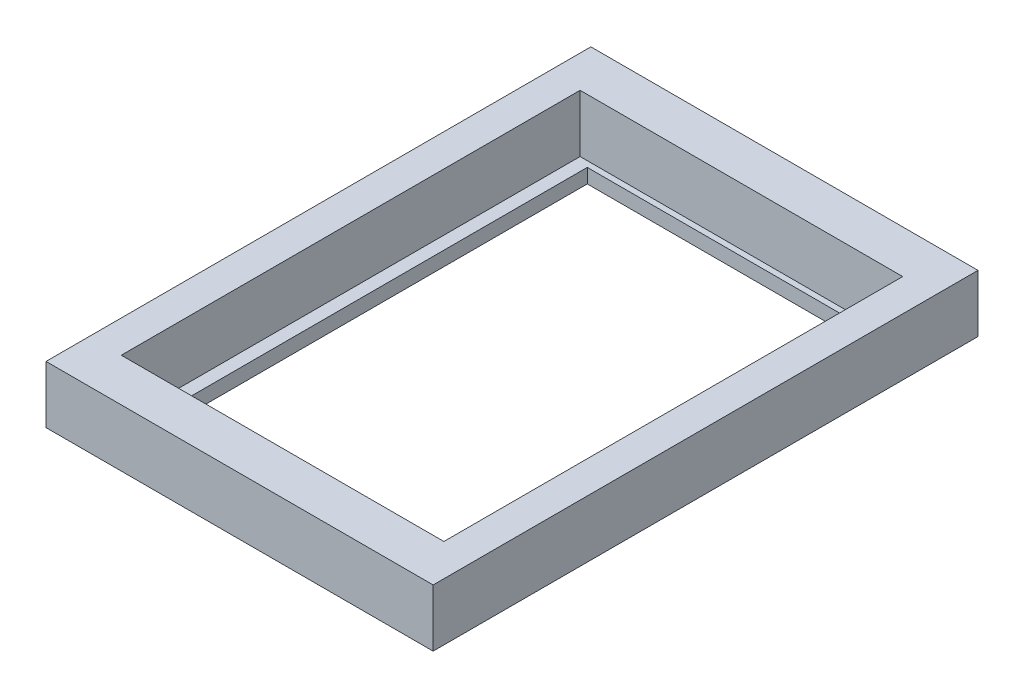
ISO-10303-21;
HEADER;
FILE_DESCRIPTION(('STEP AP214'),'2;1');
FILE_NAME('part.step','',(''),(''),'','','');
FILE_SCHEMA(('AUTOMOTIVE_DESIGN { 1 0 10303 214 1 1 1 1 }'));
ENDSEC;
DATA;
#1=APPLICATION_CONTEXT('core data for automotive mechanical design processes');
#2=APPLICATION_PROTOCOL_DEFINITION('international standard','automotive_design',2000,#1);
#3=PRODUCT_CONTEXT('',#1,'mechanical');
#4=PRODUCT('Part','Part','',(#3));
#5=PRODUCT_RELATED_PRODUCT_CATEGORY('part','',(#4));
#6=PRODUCT_DEFINITION_FORMATION('','',#4);
#7=PRODUCT_DEFINITION_CONTEXT('part definition',#1,'design');
#8=PRODUCT_DEFINITION('design','',#6,#7);
#9=PRODUCT_DEFINITION_SHAPE('','',#8);
#10=(LENGTH_UNIT() NAMED_UNIT(*) SI_UNIT(.MILLI.,.METRE.));
#11=(NAMED_UNIT(*) PLANE_ANGLE_UNIT() SI_UNIT($,.RADIAN.));
#12=(NAMED_UNIT(*) SI_UNIT($,.STERADIAN.) SOLID_ANGLE_UNIT());
#13=UNCERTAINTY_MEASURE_WITH_UNIT(LENGTH_MEASURE(1.E-05),#10,'distance_accuracy_value','');
#14=(GEOMETRIC_REPRESENTATION_CONTEXT(3) GLOBAL_UNCERTAINTY_ASSIGNED_CONTEXT((#13)) GLOBAL_UNIT_ASSIGNED_CONTEXT((#10,
#11,#12)) REPRESENTATION_CONTEXT('',''));
#15=CARTESIAN_POINT('',(0.,0.,0.));
#16=DIRECTION('',(0.,0.,1.));
#17=DIRECTION('',(1.,0.,0.));
#18=AXIS2_PLACEMENT_3D('',#15,#16,#17);
#19=CARTESIAN_POINT('',(0.,0.,0.));
#20=DIRECTION('',(0.,1.,0.));
#21=DIRECTION('',(0.,0.,1.));
#22=AXIS2_PLACEMENT_3D('',#19,#20,#21);
#23=PLANE('',#22);
#24=DIRECTION('',(0.,0.,-1.));
#25=VECTOR('',#24,1.);
#26=CARTESIAN_POINT('',(54.,0.,-76.));
#27=LINE('',#26,#25);
#28=CARTESIAN_POINT('',(54.,0.,76.));
#29=VERTEX_POINT('',#28);
#30=CARTESIAN_POINT('',(54.,0.,-76.));
#31=VERTEX_POINT('',#30);
#32=EDGE_CURVE('E290',#29,#31,#27,.T.);
#33=ORIENTED_EDGE('',*,*,#32,.F.);
#34=DIRECTION('',(1.,0.,0.));
#35=VECTOR('',#34,1.);
#36=CARTESIAN_POINT('',(-54.,0.,76.));
#37=LINE('',#36,#35);
#38=CARTESIAN_POINT('',(-54.,0.,76.));
#39=VERTEX_POINT('',#38);
#40=EDGE_CURVE('E296',#39,#29,#37,.T.);
#41=ORIENTED_EDGE('',*,*,#40,.F.);
#42=DIRECTION('',(0.,0.,1.));
#43=VECTOR('',#42,1.);
#44=CARTESIAN_POINT('',(-54.,0.,-76.));
#45=LINE('',#44,#43);
#46=CARTESIAN_POINT('',(-54.,0.,-76.));
#47=VERTEX_POINT('',#46);
#48=EDGE_CURVE('E312',#47,#39,#45,.T.);
#49=ORIENTED_EDGE('',*,*,#48,.F.);
#50=DIRECTION('',(-1.,0.,0.));
#51=VECTOR('',#50,1.);
#52=CARTESIAN_POINT('',(-54.,0.,-76.));
#53=LINE('',#52,#51);
#54=EDGE_CURVE('E309',#31,#47,#53,.T.);
#55=ORIENTED_EDGE('',*,*,#54,.F.);
#56=EDGE_LOOP('',(#33,#41,#49,#55));
#57=FACE_BOUND('',#56,.T.);
#58=DIRECTION('',(0.,0.,1.));
#59=VECTOR('',#58,1.);
#60=CARTESIAN_POINT('',(49.,0.,-69.));
#61=LINE('',#60,#59);
#62=CARTESIAN_POINT('',(49.,0.,-69.));
#63=VERTEX_POINT('',#62);
#64=CARTESIAN_POINT('',(49.,0.,69.));
#65=VERTEX_POINT('',#64);
#66=EDGE_CURVE('E234',#63,#65,#61,.T.);
#67=ORIENTED_EDGE('',*,*,#66,.F.);
#68=DIRECTION('',(1.,0.,0.));
#69=VECTOR('',#68,1.);
#70=CARTESIAN_POINT('',(-49.,0.,-69.));
#71=LINE('',#70,#69);
#72=CARTESIAN_POINT('',(-49.,0.,-69.));
#73=VERTEX_POINT('',#72);
#74=EDGE_CURVE('E251',#73,#63,#71,.T.);
#75=ORIENTED_EDGE('',*,*,#74,.F.);
#76=DIRECTION('',(0.,0.,-1.));
#77=VECTOR('',#76,1.);
#78=CARTESIAN_POINT('',(-49.,0.,-69.));
#79=LINE('',#78,#77);
#80=CARTESIAN_POINT('',(-49.,0.,69.));
#81=VERTEX_POINT('',#80);
#82=EDGE_CURVE('E268',#81,#73,#79,.T.);
#83=ORIENTED_EDGE('',*,*,#82,.F.);
#84=DIRECTION('',(-1.,0.,0.));
#85=VECTOR('',#84,1.);
#86=CARTESIAN_POINT('',(-49.,0.,69.));
#87=LINE('',#86,#85);
#88=EDGE_CURVE('E264',#65,#81,#87,.T.);
#89=ORIENTED_EDGE('',*,*,#88,.F.);
#90=EDGE_LOOP('',(#67,#75,#83,#89));
#91=FACE_BOUND('',#90,.T.);
#92=ADVANCED_FACE('F40',(#57,#91),#23,.F.);
#93=CARTESIAN_POINT('',(54.,16.,-76.));
#94=DIRECTION('',(-1.,0.,0.));
#95=DIRECTION('',(0.,0.,1.));
#96=AXIS2_PLACEMENT_3D('',#93,#94,#95);
#97=PLANE('',#96);
#98=ORIENTED_EDGE('',*,*,#32,.T.);
#99=DIRECTION('',(0.,-1.,0.));
#100=VECTOR('',#99,1.);
#101=CARTESIAN_POINT('',(54.,16.,-76.));
#102=LINE('',#101,#100);
#103=CARTESIAN_POINT('',(54.,16.,-76.));
#104=VERTEX_POINT('',#103);
#105=EDGE_CURVE('E49',#104,#31,#102,.T.);
#106=ORIENTED_EDGE('',*,*,#105,.F.);
#107=DIRECTION('',(0.,0.,-1.));
#108=VECTOR('',#107,1.);
#109=CARTESIAN_POINT('',(54.,16.,-76.));
#110=LINE('',#109,#108);
#111=CARTESIAN_POINT('',(54.,16.,76.));
#112=VERTEX_POINT('',#111);
#113=EDGE_CURVE('E291',#112,#104,#110,.T.);
#114=ORIENTED_EDGE('',*,*,#113,.F.);
#115=DIRECTION('',(0.,-1.,0.));
#116=VECTOR('',#115,1.);
#117=CARTESIAN_POINT('',(54.,16.,76.));
#118=LINE('',#117,#116);
#119=EDGE_CURVE('E305',#112,#29,#118,.T.);
#120=ORIENTED_EDGE('',*,*,#119,.T.);
#121=EDGE_LOOP('',(#98,#106,#114,#120));
#122=FACE_BOUND('',#121,.T.);
#123=ADVANCED_FACE('F42',(#122),#97,.F.);
#124=CARTESIAN_POINT('',(-54.,16.,-76.));
#125=DIRECTION('',(0.,0.,1.));
#126=DIRECTION('',(1.,0.,0.));
#127=AXIS2_PLACEMENT_3D('',#124,#125,#126);
#128=PLANE('',#127);
#129=ORIENTED_EDGE('',*,*,#54,.T.);
#130=DIRECTION('',(0.,-1.,0.));
#131=VECTOR('',#130,1.);
#132=CARTESIAN_POINT('',(-54.,16.,-76.));
#133=LINE('',#132,#131);
#134=CARTESIAN_POINT('',(-54.,16.,-76.));
#135=VERTEX_POINT('',#134);
#136=EDGE_CURVE('E324',#135,#47,#133,.T.);
#137=ORIENTED_EDGE('',*,*,#136,.F.);
#138=DIRECTION('',(-1.,0.,0.));
#139=VECTOR('',#138,1.);
#140=CARTESIAN_POINT('',(-54.,16.,-76.));
#141=LINE('',#140,#139);
#142=EDGE_CURVE('E295',#104,#135,#141,.T.);
#143=ORIENTED_EDGE('',*,*,#142,.F.);
#144=ORIENTED_EDGE('',*,*,#105,.T.);
#145=EDGE_LOOP('',(#129,#137,#143,#144));
#146=FACE_BOUND('',#145,.T.);
#147=ADVANCED_FACE('F331',(#146),#128,.F.);
#148=CARTESIAN_POINT('',(-54.,16.,-76.));
#149=DIRECTION('',(1.,0.,0.));
#150=DIRECTION('',(0.,0.,-1.));
#151=AXIS2_PLACEMENT_3D('',#148,#149,#150);
#152=PLANE('',#151);
#153=ORIENTED_EDGE('',*,*,#48,.T.);
#154=DIRECTION('',(0.,-1.,0.));
#155=VECTOR('',#154,1.);
#156=CARTESIAN_POINT('',(-54.,16.,76.));
#157=LINE('',#156,#155);
#158=CARTESIAN_POINT('',(-54.,16.,76.));
#159=VERTEX_POINT('',#158);
#160=EDGE_CURVE('E320',#159,#39,#157,.T.);
#161=ORIENTED_EDGE('',*,*,#160,.F.);
#162=DIRECTION('',(0.,0.,1.));
#163=VECTOR('',#162,1.);
#164=CARTESIAN_POINT('',(-54.,16.,-76.));
#165=LINE('',#164,#163);
#166=EDGE_CURVE('E299',#135,#159,#165,.T.);
#167=ORIENTED_EDGE('',*,*,#166,.F.);
#168=ORIENTED_EDGE('',*,*,#136,.T.);
#169=EDGE_LOOP('',(#153,#161,#167,#168));
#170=FACE_BOUND('',#169,.T.);
#171=ADVANCED_FACE('F343',(#170),#152,.F.);
#172=CARTESIAN_POINT('',(-54.,16.,76.));
#173=DIRECTION('',(0.,0.,-1.));
#174=DIRECTION('',(-1.,0.,0.));
#175=AXIS2_PLACEMENT_3D('',#172,#173,#174);
#176=PLANE('',#175);
#177=ORIENTED_EDGE('',*,*,#40,.T.);
#178=ORIENTED_EDGE('',*,*,#119,.F.);
#179=DIRECTION('',(1.,0.,0.));
#180=VECTOR('',#179,1.);
#181=CARTESIAN_POINT('',(-54.,16.,76.));
#182=LINE('',#181,#180);
#183=EDGE_CURVE('E302',#159,#112,#182,.T.);
#184=ORIENTED_EDGE('',*,*,#183,.F.);
#185=ORIENTED_EDGE('',*,*,#160,.T.);
#186=EDGE_LOOP('',(#177,#178,#184,#185));
#187=FACE_BOUND('',#186,.T.);
#188=ADVANCED_FACE('F347',(#187),#176,.F.);
#189=CARTESIAN_POINT('',(0.,16.,0.));
#190=DIRECTION('',(0.,1.,0.));
#191=DIRECTION('',(0.,0.,1.));
#192=AXIS2_PLACEMENT_3D('',#189,#190,#191);
#193=PLANE('',#192);
#194=DIRECTION('',(0.,0.,-1.));
#195=VECTOR('',#194,1.);
#196=CARTESIAN_POINT('',(45.,16.,64.));
#197=LINE('',#196,#195);
#198=CARTESIAN_POINT('',(45.,16.,64.));
#199=VERTEX_POINT('',#198);
#200=CARTESIAN_POINT('',(45.,16.,-64.));
#201=VERTEX_POINT('',#200);
#202=EDGE_CURVE('E56',#199,#201,#197,.T.);
#203=ORIENTED_EDGE('',*,*,#202,.F.);
#204=DIRECTION('',(1.,0.,0.));
#205=VECTOR('',#204,1.);
#206=CARTESIAN_POINT('',(-45.,16.,64.));
#207=LINE('',#206,#205);
#208=CARTESIAN_POINT('',(-45.,16.,64.));
#209=VERTEX_POINT('',#208);
#210=EDGE_CURVE('E176',#209,#199,#207,.T.);
#211=ORIENTED_EDGE('',*,*,#210,.F.);
#212=DIRECTION('',(0.,0.,1.));
#213=VECTOR('',#212,1.);
#214=CARTESIAN_POINT('',(-45.,16.,64.));
#215=LINE('',#214,#213);
#216=CARTESIAN_POINT('',(-45.,16.,-64.));
#217=VERTEX_POINT('',#216);
#218=EDGE_CURVE('E180',#217,#209,#215,.T.);
#219=ORIENTED_EDGE('',*,*,#218,.F.);
#220=DIRECTION('',(-1.,0.,0.));
#221=VECTOR('',#220,1.);
#222=CARTESIAN_POINT('',(-45.,16.,-64.));
#223=LINE('',#222,#221);
#224=EDGE_CURVE('E189',#201,#217,#223,.T.);
#225=ORIENTED_EDGE('',*,*,#224,.F.);
#226=EDGE_LOOP('',(#203,#211,#219,#225));
#227=FACE_BOUND('',#226,.T.);
#228=ORIENTED_EDGE('',*,*,#113,.T.);
#229=ORIENTED_EDGE('',*,*,#142,.T.);
#230=ORIENTED_EDGE('',*,*,#166,.T.);
#231=ORIENTED_EDGE('',*,*,#183,.T.);
#232=EDGE_LOOP('',(#228,#229,#230,#231));
#233=FACE_BOUND('',#232,.T.);
#234=ADVANCED_FACE('F349',(#227,#233),#193,.T.);
#235=CARTESIAN_POINT('',(49.,-4.,-69.));
#236=DIRECTION('',(-1.,0.,0.));
#237=DIRECTION('',(0.,0.,1.));
#238=AXIS2_PLACEMENT_3D('',#235,#236,#237);
#239=PLANE('',#238);
#240=ORIENTED_EDGE('',*,*,#66,.T.);
#241=DIRECTION('',(0.,1.,0.));
#242=VECTOR('',#241,1.);
#243=CARTESIAN_POINT('',(49.,-4.,69.));
#244=LINE('',#243,#242);
#245=CARTESIAN_POINT('',(49.,-4.,69.));
#246=VERTEX_POINT('',#245);
#247=EDGE_CURVE('E286',#246,#65,#244,.T.);
#248=ORIENTED_EDGE('',*,*,#247,.F.);
#249=DIRECTION('',(0.,0.,1.));
#250=VECTOR('',#249,1.);
#251=CARTESIAN_POINT('',(49.,-4.,-69.));
#252=LINE('',#251,#250);
#253=CARTESIAN_POINT('',(49.,-4.,-69.));
#254=VERTEX_POINT('',#253);
#255=EDGE_CURVE('E246',#254,#246,#252,.T.);
#256=ORIENTED_EDGE('',*,*,#255,.F.);
#257=DIRECTION('',(0.,1.,0.));
#258=VECTOR('',#257,1.);
#259=CARTESIAN_POINT('',(49.,-4.,-69.));
#260=LINE('',#259,#258);
#261=EDGE_CURVE('E260',#254,#63,#260,.T.);
#262=ORIENTED_EDGE('',*,*,#261,.T.);
#263=EDGE_LOOP('',(#240,#248,#256,#262));
#264=FACE_BOUND('',#263,.T.);
#265=ADVANCED_FACE('F351',(#264),#239,.F.);
#266=CARTESIAN_POINT('',(-49.,-4.,69.));
#267=DIRECTION('',(0.,0.,-1.));
#268=DIRECTION('',(-1.,0.,0.));
#269=AXIS2_PLACEMENT_3D('',#266,#267,#268);
#270=PLANE('',#269);
#271=ORIENTED_EDGE('',*,*,#88,.T.);
#272=DIRECTION('',(0.,1.,0.));
#273=VECTOR('',#272,1.);
#274=CARTESIAN_POINT('',(-49.,-4.,69.));
#275=LINE('',#274,#273);
#276=CARTESIAN_POINT('',(-49.,-4.,69.));
#277=VERTEX_POINT('',#276);
#278=EDGE_CURVE('E282',#277,#81,#275,.T.);
#279=ORIENTED_EDGE('',*,*,#278,.F.);
#280=DIRECTION('',(-1.,0.,0.));
#281=VECTOR('',#280,1.);
#282=CARTESIAN_POINT('',(-49.,-4.,69.));
#283=LINE('',#282,#281);
#284=EDGE_CURVE('E250',#246,#277,#283,.T.);
#285=ORIENTED_EDGE('',*,*,#284,.F.);
#286=ORIENTED_EDGE('',*,*,#247,.T.);
#287=EDGE_LOOP('',(#271,#279,#285,#286));
#288=FACE_BOUND('',#287,.T.);
#289=ADVANCED_FACE('F358',(#288),#270,.F.);
#290=CARTESIAN_POINT('',(-49.,-4.,-69.));
#291=DIRECTION('',(1.,0.,0.));
#292=DIRECTION('',(0.,0.,-1.));
#293=AXIS2_PLACEMENT_3D('',#290,#291,#292);
#294=PLANE('',#293);
#295=ORIENTED_EDGE('',*,*,#82,.T.);
#296=DIRECTION('',(0.,1.,0.));
#297=VECTOR('',#296,1.);
#298=CARTESIAN_POINT('',(-49.,-4.,-69.));
#299=LINE('',#298,#297);
#300=CARTESIAN_POINT('',(-49.,-4.,-69.));
#301=VERTEX_POINT('',#300);
#302=EDGE_CURVE('E278',#301,#73,#299,.T.);
#303=ORIENTED_EDGE('',*,*,#302,.F.);
#304=DIRECTION('',(0.,0.,-1.));
#305=VECTOR('',#304,1.);
#306=CARTESIAN_POINT('',(-49.,-4.,-69.));
#307=LINE('',#306,#305);
#308=EDGE_CURVE('E254',#277,#301,#307,.T.);
#309=ORIENTED_EDGE('',*,*,#308,.F.);
#310=ORIENTED_EDGE('',*,*,#278,.T.);
#311=EDGE_LOOP('',(#295,#303,#309,#310));
#312=FACE_BOUND('',#311,.T.);
#313=ADVANCED_FACE('F402',(#312),#294,.F.);
#314=CARTESIAN_POINT('',(-49.,-4.,-69.));
#315=DIRECTION('',(0.,0.,1.));
#316=DIRECTION('',(1.,0.,0.));
#317=AXIS2_PLACEMENT_3D('',#314,#315,#316);
#318=PLANE('',#317);
#319=ORIENTED_EDGE('',*,*,#74,.T.);
#320=ORIENTED_EDGE('',*,*,#261,.F.);
#321=DIRECTION('',(1.,0.,0.));
#322=VECTOR('',#321,1.);
#323=CARTESIAN_POINT('',(-49.,-4.,-69.));
#324=LINE('',#323,#322);
#325=EDGE_CURVE('E257',#301,#254,#324,.T.);
#326=ORIENTED_EDGE('',*,*,#325,.F.);
#327=ORIENTED_EDGE('',*,*,#302,.T.);
#328=EDGE_LOOP('',(#319,#320,#326,#327));
#329=FACE_BOUND('',#328,.T.);
#330=ADVANCED_FACE('F412',(#329),#318,.F.);
#331=CARTESIAN_POINT('',(0.,-4.,0.));
#332=DIRECTION('',(0.,1.,0.));
#333=DIRECTION('',(0.,0.,1.));
#334=AXIS2_PLACEMENT_3D('',#331,#332,#333);
#335=PLANE('',#334);
#336=DIRECTION('',(1.,0.,0.));
#337=VECTOR('',#336,1.);
#338=CARTESIAN_POINT('',(-41.375,-4.,62.375));
#339=LINE('',#338,#337);
#340=CARTESIAN_POINT('',(-41.375,-4.,62.375));
#341=VERTEX_POINT('',#340);
#342=CARTESIAN_POINT('',(41.375,-4.,62.375));
#343=VERTEX_POINT('',#342);
#344=EDGE_CURVE('E225',#341,#343,#339,.T.);
#345=ORIENTED_EDGE('',*,*,#344,.T.);
#346=DIRECTION('',(0.,0.,-1.));
#347=VECTOR('',#346,1.);
#348=CARTESIAN_POINT('',(41.375,-4.,62.375));
#349=LINE('',#348,#347);
#350=CARTESIAN_POINT('',(41.375,-4.,-62.375));
#351=VERTEX_POINT('',#350);
#352=EDGE_CURVE('E213',#343,#351,#349,.T.);
#353=ORIENTED_EDGE('',*,*,#352,.T.);
#354=DIRECTION('',(-1.,0.,0.));
#355=VECTOR('',#354,1.);
#356=CARTESIAN_POINT('',(-41.375,-4.,-62.375));
#357=LINE('',#356,#355);
#358=CARTESIAN_POINT('',(-41.375,-4.,-62.375));
#359=VERTEX_POINT('',#358);
#360=EDGE_CURVE('E217',#351,#359,#357,.T.);
#361=ORIENTED_EDGE('',*,*,#360,.T.);
#362=DIRECTION('',(0.,0.,1.));
#363=VECTOR('',#362,1.);
#364=CARTESIAN_POINT('',(-41.375,-4.,62.375));
#365=LINE('',#364,#363);
#366=EDGE_CURVE('E221',#359,#341,#365,.T.);
#367=ORIENTED_EDGE('',*,*,#366,.T.);
#368=EDGE_LOOP('',(#345,#353,#361,#367));
#369=FACE_BOUND('',#368,.T.);
#370=ORIENTED_EDGE('',*,*,#255,.T.);
#371=ORIENTED_EDGE('',*,*,#284,.T.);
#372=ORIENTED_EDGE('',*,*,#308,.T.);
#373=ORIENTED_EDGE('',*,*,#325,.T.);
#374=EDGE_LOOP('',(#370,#371,#372,#373));
#375=FACE_BOUND('',#374,.T.);
#376=ADVANCED_FACE('F422',(#369,#375),#335,.F.);
#377=CARTESIAN_POINT('',(41.375,-4.,62.375));
#378=DIRECTION('',(1.,0.,0.));
#379=DIRECTION('',(0.,0.,-1.));
#380=AXIS2_PLACEMENT_3D('',#377,#378,#379);
#381=PLANE('',#380);
#382=DIRECTION('',(0.,1.,0.));
#383=VECTOR('',#382,1.);
#384=CARTESIAN_POINT('',(41.375,-4.,62.375));
#385=LINE('',#384,#383);
#386=CARTESIAN_POINT('',(41.375,0.,62.375));
#387=VERTEX_POINT('',#386);
#388=EDGE_CURVE('E230',#343,#387,#385,.T.);
#389=ORIENTED_EDGE('',*,*,#388,.T.);
#390=DIRECTION('',(0.,0.,-1.));
#391=VECTOR('',#390,1.);
#392=CARTESIAN_POINT('',(41.375,0.,62.375));
#393=LINE('',#392,#391);
#394=CARTESIAN_POINT('',(41.375,0.,-62.375));
#395=VERTEX_POINT('',#394);
#396=EDGE_CURVE('E209',#387,#395,#393,.T.);
#397=ORIENTED_EDGE('',*,*,#396,.T.);
#398=DIRECTION('',(0.,1.,0.));
#399=VECTOR('',#398,1.);
#400=CARTESIAN_POINT('',(41.375,-4.,-62.375));
#401=LINE('',#400,#399);
#402=EDGE_CURVE('E229',#351,#395,#401,.T.);
#403=ORIENTED_EDGE('',*,*,#402,.F.);
#404=ORIENTED_EDGE('',*,*,#352,.F.);
#405=EDGE_LOOP('',(#389,#397,#403,#404));
#406=FACE_BOUND('',#405,.T.);
#407=ADVANCED_FACE('F431',(#406),#381,.F.);
#408=CARTESIAN_POINT('',(-41.375,-4.,62.375));
#409=DIRECTION('',(0.,0.,1.));
#410=DIRECTION('',(1.,0.,0.));
#411=AXIS2_PLACEMENT_3D('',#408,#409,#410);
#412=PLANE('',#411);
#413=DIRECTION('',(0.,1.,0.));
#414=VECTOR('',#413,1.);
#415=CARTESIAN_POINT('',(-41.375,-4.,62.375));
#416=LINE('',#415,#414);
#417=CARTESIAN_POINT('',(-41.375,0.,62.375));
#418=VERTEX_POINT('',#417);
#419=EDGE_CURVE('E235',#341,#418,#416,.T.);
#420=ORIENTED_EDGE('',*,*,#419,.T.);
#421=DIRECTION('',(1.,0.,0.));
#422=VECTOR('',#421,1.);
#423=CARTESIAN_POINT('',(-41.375,0.,62.375));
#424=LINE('',#423,#422);
#425=EDGE_CURVE('E205',#418,#387,#424,.T.);
#426=ORIENTED_EDGE('',*,*,#425,.T.);
#427=ORIENTED_EDGE('',*,*,#388,.F.);
#428=ORIENTED_EDGE('',*,*,#344,.F.);
#429=EDGE_LOOP('',(#420,#426,#427,#428));
#430=FACE_BOUND('',#429,.T.);
#431=ADVANCED_FACE('F445',(#430),#412,.F.);
#432=CARTESIAN_POINT('',(-41.375,-4.,62.375));
#433=DIRECTION('',(-1.,0.,0.));
#434=DIRECTION('',(0.,0.,1.));
#435=AXIS2_PLACEMENT_3D('',#432,#433,#434);
#436=PLANE('',#435);
#437=DIRECTION('',(0.,1.,0.));
#438=VECTOR('',#437,1.);
#439=CARTESIAN_POINT('',(-41.375,-4.,-62.375));
#440=LINE('',#439,#438);
#441=CARTESIAN_POINT('',(-41.375,0.,-62.375));
#442=VERTEX_POINT('',#441);
#443=EDGE_CURVE('E239',#359,#442,#440,.T.);
#444=ORIENTED_EDGE('',*,*,#443,.T.);
#445=DIRECTION('',(0.,0.,1.));
#446=VECTOR('',#445,1.);
#447=CARTESIAN_POINT('',(-41.375,0.,62.375));
#448=LINE('',#447,#446);
#449=EDGE_CURVE('E64',#442,#418,#448,.T.);
#450=ORIENTED_EDGE('',*,*,#449,.T.);
#451=ORIENTED_EDGE('',*,*,#419,.F.);
#452=ORIENTED_EDGE('',*,*,#366,.F.);
#453=EDGE_LOOP('',(#444,#450,#451,#452));
#454=FACE_BOUND('',#453,.T.);
#455=ADVANCED_FACE('F455',(#454),#436,.F.);
#456=CARTESIAN_POINT('',(-41.375,-4.,-62.375));
#457=DIRECTION('',(0.,0.,-1.));
#458=DIRECTION('',(-1.,0.,0.));
#459=AXIS2_PLACEMENT_3D('',#456,#457,#458);
#460=PLANE('',#459);
#461=ORIENTED_EDGE('',*,*,#402,.T.);
#462=DIRECTION('',(-1.,0.,0.));
#463=VECTOR('',#462,1.);
#464=CARTESIAN_POINT('',(-41.375,0.,-62.375));
#465=LINE('',#464,#463);
#466=EDGE_CURVE('E11',#395,#442,#465,.T.);
#467=ORIENTED_EDGE('',*,*,#466,.T.);
#468=ORIENTED_EDGE('',*,*,#443,.F.);
#469=ORIENTED_EDGE('',*,*,#360,.F.);
#470=EDGE_LOOP('',(#461,#467,#468,#469));
#471=FACE_BOUND('',#470,.T.);
#472=ADVANCED_FACE('F465',(#471),#460,.F.);
#473=CARTESIAN_POINT('',(0.,0.,0.));
#474=DIRECTION('',(0.,-1.,0.));
#475=DIRECTION('',(0.,0.,-1.));
#476=AXIS2_PLACEMENT_3D('',#473,#474,#475);
#477=PLANE('',#476);
#478=DIRECTION('',(0.,0.,-1.));
#479=VECTOR('',#478,1.);
#480=CARTESIAN_POINT('',(45.,0.,64.));
#481=LINE('',#480,#479);
#482=CARTESIAN_POINT('',(45.,0.,64.));
#483=VERTEX_POINT('',#482);
#484=CARTESIAN_POINT('',(45.,0.,-64.));
#485=VERTEX_POINT('',#484);
#486=EDGE_CURVE('E155',#483,#485,#481,.T.);
#487=ORIENTED_EDGE('',*,*,#486,.T.);
#488=DIRECTION('',(-1.,0.,0.));
#489=VECTOR('',#488,1.);
#490=CARTESIAN_POINT('',(-45.,0.,-64.));
#491=LINE('',#490,#489);
#492=CARTESIAN_POINT('',(-45.,0.,-64.));
#493=VERTEX_POINT('',#492);
#494=EDGE_CURVE('E165',#485,#493,#491,.T.);
#495=ORIENTED_EDGE('',*,*,#494,.T.);
#496=DIRECTION('',(0.,0.,1.));
#497=VECTOR('',#496,1.);
#498=CARTESIAN_POINT('',(-45.,0.,64.));
#499=LINE('',#498,#497);
#500=CARTESIAN_POINT('',(-45.,0.,64.));
#501=VERTEX_POINT('',#500);
#502=EDGE_CURVE('E171',#493,#501,#499,.T.);
#503=ORIENTED_EDGE('',*,*,#502,.T.);
#504=DIRECTION('',(1.,0.,0.));
#505=VECTOR('',#504,1.);
#506=CARTESIAN_POINT('',(-45.,0.,64.));
#507=LINE('',#506,#505);
#508=EDGE_CURVE('E162',#501,#483,#507,.T.);
#509=ORIENTED_EDGE('',*,*,#508,.T.);
#510=EDGE_LOOP('',(#487,#495,#503,#509));
#511=FACE_BOUND('',#510,.T.);
#512=ORIENTED_EDGE('',*,*,#425,.F.);
#513=ORIENTED_EDGE('',*,*,#449,.F.);
#514=ORIENTED_EDGE('',*,*,#466,.F.);
#515=ORIENTED_EDGE('',*,*,#396,.F.);
#516=EDGE_LOOP('',(#512,#513,#514,#515));
#517=FACE_BOUND('',#516,.T.);
#518=ADVANCED_FACE('F173',(#511,#517),#477,.F.);
#519=CARTESIAN_POINT('',(45.,0.,64.));
#520=DIRECTION('',(1.,0.,0.));
#521=DIRECTION('',(0.,0.,-1.));
#522=AXIS2_PLACEMENT_3D('',#519,#520,#521);
#523=PLANE('',#522);
#524=ORIENTED_EDGE('',*,*,#202,.T.);
#525=DIRECTION('',(0.,1.,0.));
#526=VECTOR('',#525,1.);
#527=CARTESIAN_POINT('',(45.,0.,-64.));
#528=LINE('',#527,#526);
#529=EDGE_CURVE('E151',#485,#201,#528,.T.);
#530=ORIENTED_EDGE('',*,*,#529,.F.);
#531=ORIENTED_EDGE('',*,*,#486,.F.);
#532=DIRECTION('',(0.,1.,0.));
#533=VECTOR('',#532,1.);
#534=CARTESIAN_POINT('',(45.,0.,64.));
#535=LINE('',#534,#533);
#536=EDGE_CURVE('E195',#483,#199,#535,.T.);
#537=ORIENTED_EDGE('',*,*,#536,.T.);
#538=EDGE_LOOP('',(#524,#530,#531,#537));
#539=FACE_BOUND('',#538,.T.);
#540=ADVANCED_FACE('F153',(#539),#523,.F.);
#541=CARTESIAN_POINT('',(-45.,0.,64.));
#542=DIRECTION('',(0.,0.,1.));
#543=DIRECTION('',(1.,0.,0.));
#544=AXIS2_PLACEMENT_3D('',#541,#542,#543);
#545=PLANE('',#544);
#546=ORIENTED_EDGE('',*,*,#210,.T.);
#547=ORIENTED_EDGE('',*,*,#536,.F.);
#548=ORIENTED_EDGE('',*,*,#508,.F.);
#549=DIRECTION('',(0.,1.,0.));
#550=VECTOR('',#549,1.);
#551=CARTESIAN_POINT('',(-45.,0.,64.));
#552=LINE('',#551,#550);
#553=EDGE_CURVE('E198',#501,#209,#552,.T.);
#554=ORIENTED_EDGE('',*,*,#553,.T.);
#555=EDGE_LOOP('',(#546,#547,#548,#554));
#556=FACE_BOUND('',#555,.T.);
#557=ADVANCED_FACE('F492',(#556),#545,.F.);
#558=CARTESIAN_POINT('',(-45.,0.,64.));
#559=DIRECTION('',(-1.,0.,0.));
#560=DIRECTION('',(0.,0.,1.));
#561=AXIS2_PLACEMENT_3D('',#558,#559,#560);
#562=PLANE('',#561);
#563=ORIENTED_EDGE('',*,*,#218,.T.);
#564=ORIENTED_EDGE('',*,*,#553,.F.);
#565=ORIENTED_EDGE('',*,*,#502,.F.);
#566=DIRECTION('',(0.,1.,0.));
#567=VECTOR('',#566,1.);
#568=CARTESIAN_POINT('',(-45.,0.,-64.));
#569=LINE('',#568,#567);
#570=EDGE_CURVE('E161',#493,#217,#569,.T.);
#571=ORIENTED_EDGE('',*,*,#570,.T.);
#572=EDGE_LOOP('',(#563,#564,#565,#571));
#573=FACE_BOUND('',#572,.T.);
#574=ADVANCED_FACE('F501',(#573),#562,.F.);
#575=CARTESIAN_POINT('',(-45.,0.,-64.));
#576=DIRECTION('',(0.,0.,-1.));
#577=DIRECTION('',(-1.,0.,0.));
#578=AXIS2_PLACEMENT_3D('',#575,#576,#577);
#579=PLANE('',#578);
#580=ORIENTED_EDGE('',*,*,#224,.T.);
#581=ORIENTED_EDGE('',*,*,#570,.F.);
#582=ORIENTED_EDGE('',*,*,#494,.F.);
#583=ORIENTED_EDGE('',*,*,#529,.T.);
#584=EDGE_LOOP('',(#580,#581,#582,#583));
#585=FACE_BOUND('',#584,.T.);
#586=ADVANCED_FACE('F166',(#585),#579,.F.);
#587=CLOSED_SHELL('',(#92,#123,#147,#171,#188,#234,#265,#289,#313,#330,#376,#407,#431,#455,#472,
#518,#540,#557,#574,#586));
#588=MANIFOLD_SOLID_BREP('B2',#587);
#589=ADVANCED_BREP_SHAPE_REPRESENTATION('',(#18,#588),#14);
#590=SHAPE_DEFINITION_REPRESENTATION(#9,#589);
ENDSEC;
END-ISO-10303-21;
